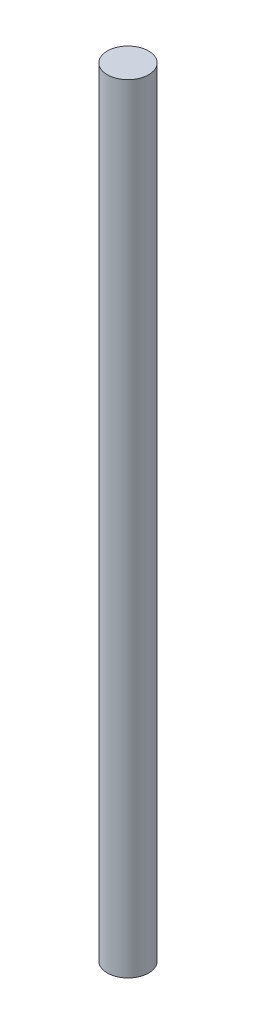
ISO-10303-21;
HEADER;
FILE_DESCRIPTION(('STEP AP214'),'2;1');
FILE_NAME('part.step','',(''),(''),'','','');
FILE_SCHEMA(('AUTOMOTIVE_DESIGN { 1 0 10303 214 1 1 1 1 }'));
ENDSEC;
DATA;
#1=APPLICATION_CONTEXT('core data for automotive mechanical design processes');
#2=APPLICATION_PROTOCOL_DEFINITION('international standard','automotive_design',2000,#1);
#3=PRODUCT_CONTEXT('',#1,'mechanical');
#4=PRODUCT('Part','Part','',(#3));
#5=PRODUCT_RELATED_PRODUCT_CATEGORY('part','',(#4));
#6=PRODUCT_DEFINITION_FORMATION('','',#4);
#7=PRODUCT_DEFINITION_CONTEXT('part definition',#1,'design');
#8=PRODUCT_DEFINITION('design','',#6,#7);
#9=PRODUCT_DEFINITION_SHAPE('','',#8);
#10=(LENGTH_UNIT() NAMED_UNIT(*) SI_UNIT(.MILLI.,.METRE.));
#11=(NAMED_UNIT(*) PLANE_ANGLE_UNIT() SI_UNIT($,.RADIAN.));
#12=(NAMED_UNIT(*) SI_UNIT($,.STERADIAN.) SOLID_ANGLE_UNIT());
#13=UNCERTAINTY_MEASURE_WITH_UNIT(LENGTH_MEASURE(1.E-05),#10,'distance_accuracy_value','');
#14=(GEOMETRIC_REPRESENTATION_CONTEXT(3) GLOBAL_UNCERTAINTY_ASSIGNED_CONTEXT((#13)) GLOBAL_UNIT_ASSIGNED_CONTEXT((#10,
#11,#12)) REPRESENTATION_CONTEXT('',''));
#15=CARTESIAN_POINT('',(0.,0.,0.));
#16=DIRECTION('',(0.,0.,1.));
#17=DIRECTION('',(1.,0.,0.));
#18=AXIS2_PLACEMENT_3D('',#15,#16,#17);
#19=CARTESIAN_POINT('',(0.,29.9085,0.));
#20=DIRECTION('',(0.,-1.,0.));
#21=DIRECTION('',(0.,0.,-1.));
#22=AXIS2_PLACEMENT_3D('',#19,#20,#21);
#23=CYLINDRICAL_SURFACE('',#22,0.79375);
#24=CARTESIAN_POINT('',(0.,29.9085,0.));
#25=DIRECTION('',(0.,1.,0.));
#26=DIRECTION('',(0.,0.,1.));
#27=AXIS2_PLACEMENT_3D('',#24,#25,#26);
#28=CIRCLE('',#27,0.79375);
#29=CARTESIAN_POINT('',(0.,29.9085,0.79375));
#30=VERTEX_POINT('',#29);
#31=EDGE_CURVE('E10',#30,#30,#28,.T.);
#32=ORIENTED_EDGE('',*,*,#31,.F.);
#33=EDGE_LOOP('',(#32));
#34=FACE_BOUND('',#33,.T.);
#35=CARTESIAN_POINT('',(0.,0.,0.));
#36=DIRECTION('',(0.,1.,0.));
#37=DIRECTION('',(0.,0.,1.));
#38=AXIS2_PLACEMENT_3D('',#35,#36,#37);
#39=CIRCLE('',#38,0.79375);
#40=CARTESIAN_POINT('',(0.,0.,0.79375));
#41=VERTEX_POINT('',#40);
#42=EDGE_CURVE('E34',#41,#41,#39,.T.);
#43=ORIENTED_EDGE('',*,*,#42,.T.);
#44=EDGE_LOOP('',(#43));
#45=FACE_BOUND('',#44,.T.);
#46=ADVANCED_FACE('F31',(#34,#45),#23,.T.);
#47=CARTESIAN_POINT('',(0.,29.9085,0.));
#48=DIRECTION('',(0.,1.,0.));
#49=DIRECTION('',(0.,0.,1.));
#50=AXIS2_PLACEMENT_3D('',#47,#48,#49);
#51=PLANE('',#50);
#52=ORIENTED_EDGE('',*,*,#31,.T.);
#53=EDGE_LOOP('',(#52));
#54=FACE_BOUND('',#53,.T.);
#55=ADVANCED_FACE('F46',(#54),#51,.T.);
#56=CARTESIAN_POINT('',(0.,0.,0.));
#57=DIRECTION('',(0.,1.,0.));
#58=DIRECTION('',(0.,0.,1.));
#59=AXIS2_PLACEMENT_3D('',#56,#57,#58);
#60=PLANE('',#59);
#61=ORIENTED_EDGE('',*,*,#42,.F.);
#62=EDGE_LOOP('',(#61));
#63=FACE_BOUND('',#62,.T.);
#64=ADVANCED_FACE('F44',(#63),#60,.F.);
#65=CLOSED_SHELL('',(#46,#55,#64));
#66=MANIFOLD_SOLID_BREP('B2',#65);
#67=ADVANCED_BREP_SHAPE_REPRESENTATION('',(#18,#66),#14);
#68=SHAPE_DEFINITION_REPRESENTATION(#9,#67);
ENDSEC;
END-ISO-10303-21;
